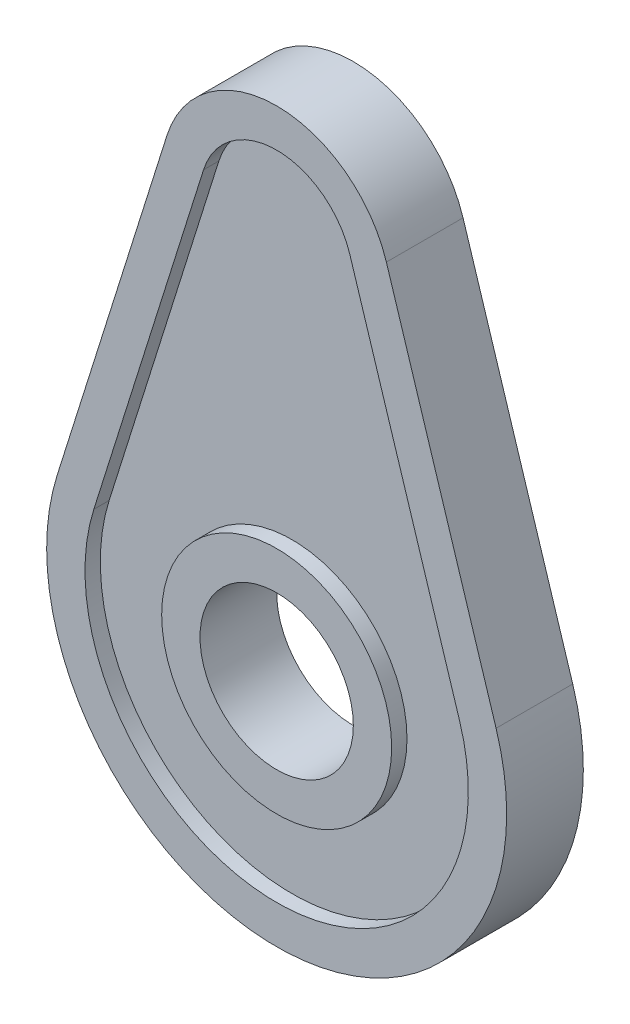
ISO-10303-21;
HEADER;
FILE_DESCRIPTION(('STEP AP214'),'2;1');
FILE_NAME('part.step','',(''),(''),'','','');
FILE_SCHEMA(('AUTOMOTIVE_DESIGN { 1 0 10303 214 1 1 1 1 }'));
ENDSEC;
DATA;
#1=APPLICATION_CONTEXT('core data for automotive mechanical design processes');
#2=APPLICATION_PROTOCOL_DEFINITION('international standard','automotive_design',2000,#1);
#3=PRODUCT_CONTEXT('',#1,'mechanical');
#4=PRODUCT('Part','Part','',(#3));
#5=PRODUCT_RELATED_PRODUCT_CATEGORY('part','',(#4));
#6=PRODUCT_DEFINITION_FORMATION('','',#4);
#7=PRODUCT_DEFINITION_CONTEXT('part definition',#1,'design');
#8=PRODUCT_DEFINITION('design','',#6,#7);
#9=PRODUCT_DEFINITION_SHAPE('','',#8);
#10=(LENGTH_UNIT() NAMED_UNIT(*) SI_UNIT(.MILLI.,.METRE.));
#11=(NAMED_UNIT(*) PLANE_ANGLE_UNIT() SI_UNIT($,.RADIAN.));
#12=(NAMED_UNIT(*) SI_UNIT($,.STERADIAN.) SOLID_ANGLE_UNIT());
#13=UNCERTAINTY_MEASURE_WITH_UNIT(LENGTH_MEASURE(1.E-05),#10,'distance_accuracy_value','');
#14=(GEOMETRIC_REPRESENTATION_CONTEXT(3) GLOBAL_UNCERTAINTY_ASSIGNED_CONTEXT((#13)) GLOBAL_UNIT_ASSIGNED_CONTEXT((#10,
#11,#12)) REPRESENTATION_CONTEXT('',''));
#15=CARTESIAN_POINT('',(0.,0.,0.));
#16=DIRECTION('',(0.,0.,1.));
#17=DIRECTION('',(1.,0.,0.));
#18=AXIS2_PLACEMENT_3D('',#15,#16,#17);
#19=CARTESIAN_POINT('',(0.,0.,0.));
#20=DIRECTION('',(0.,0.,1.));
#21=DIRECTION('',(1.,0.,0.));
#22=AXIS2_PLACEMENT_3D('',#19,#20,#21);
#23=PLANE('',#22);
#24=CARTESIAN_POINT('',(0.,0.,0.));
#25=DIRECTION('',(0.,0.,1.));
#26=DIRECTION('',(1.,0.,0.));
#27=AXIS2_PLACEMENT_3D('',#24,#25,#26);
#28=CIRCLE('',#27,10.);
#29=CARTESIAN_POINT('',(10.,0.,0.));
#30=VERTEX_POINT('',#29);
#31=EDGE_CURVE('E200',#30,#30,#28,.T.);
#32=ORIENTED_EDGE('',*,*,#31,.T.);
#33=EDGE_LOOP('',(#32));
#34=FACE_BOUND('',#33,.T.);
#35=CARTESIAN_POINT('',(0.,0.,0.));
#36=DIRECTION('',(0.,0.,1.));
#37=DIRECTION('',(1.,0.,0.));
#38=AXIS2_PLACEMENT_3D('',#35,#36,#37);
#39=CIRCLE('',#38,15.);
#40=CARTESIAN_POINT('',(15.,0.,0.));
#41=VERTEX_POINT('',#40);
#42=EDGE_CURVE('E153',#41,#41,#39,.T.);
#43=ORIENTED_EDGE('',*,*,#42,.F.);
#44=EDGE_LOOP('',(#43));
#45=FACE_BOUND('',#44,.T.);
#46=ADVANCED_FACE('F37',(#34,#45),#23,.F.);
#47=CARTESIAN_POINT('',(0.,0.,10.));
#48=DIRECTION('',(0.,0.,1.));
#49=DIRECTION('',(1.,0.,0.));
#50=AXIS2_PLACEMENT_3D('',#47,#48,#49);
#51=PLANE('',#50);
#52=CARTESIAN_POINT('',(0.,0.,10.));
#53=DIRECTION('',(0.,0.,1.));
#54=DIRECTION('',(1.,0.,0.));
#55=AXIS2_PLACEMENT_3D('',#52,#53,#54);
#56=CIRCLE('',#55,10.);
#57=CARTESIAN_POINT('',(10.,0.,10.));
#58=VERTEX_POINT('',#57);
#59=EDGE_CURVE('E206',#58,#58,#56,.T.);
#60=ORIENTED_EDGE('',*,*,#59,.F.);
#61=EDGE_LOOP('',(#60));
#62=FACE_BOUND('',#61,.T.);
#63=CARTESIAN_POINT('',(0.,0.,10.));
#64=DIRECTION('',(0.,0.,1.));
#65=DIRECTION('',(1.,0.,0.));
#66=AXIS2_PLACEMENT_3D('',#63,#64,#65);
#67=CIRCLE('',#66,15.);
#68=CARTESIAN_POINT('',(15.,0.,10.));
#69=VERTEX_POINT('',#68);
#70=EDGE_CURVE('E166',#69,#69,#67,.T.);
#71=ORIENTED_EDGE('',*,*,#70,.T.);
#72=EDGE_LOOP('',(#71));
#73=FACE_BOUND('',#72,.T.);
#74=ADVANCED_FACE('F263',(#62,#73),#51,.T.);
#75=CARTESIAN_POINT('',(0.,0.,10.));
#76=DIRECTION('',(0.,0.,1.));
#77=DIRECTION('',(1.,0.,0.));
#78=AXIS2_PLACEMENT_3D('',#75,#76,#77);
#79=CIRCLE('',#78,25.);
#80=CARTESIAN_POINT('',(-23.8484800354236,7.50000000000001,10.));
#81=VERTEX_POINT('',#80);
#82=CARTESIAN_POINT('',(23.8484800354236,7.50000000000001,10.));
#83=VERTEX_POINT('',#82);
#84=EDGE_CURVE('E60',#81,#83,#79,.T.);
#85=ORIENTED_EDGE('',*,*,#84,.F.);
#86=DIRECTION('',(-0.3,-0.953939201416946,0.));
#87=VECTOR('',#86,1.);
#88=CARTESIAN_POINT('',(-9.53939201416945,53.,10.));
#89=LINE('',#88,#87);
#90=CARTESIAN_POINT('',(-9.53939201416945,53.,10.));
#91=VERTEX_POINT('',#90);
#92=EDGE_CURVE('E179',#91,#81,#89,.T.);
#93=ORIENTED_EDGE('',*,*,#92,.F.);
#94=CARTESIAN_POINT('',(0.,50.,10.));
#95=DIRECTION('',(0.,0.,1.));
#96=DIRECTION('',(1.,0.,0.));
#97=AXIS2_PLACEMENT_3D('',#94,#95,#96);
#98=CIRCLE('',#97,10.);
#99=CARTESIAN_POINT('',(9.53939201416945,53.,10.));
#100=VERTEX_POINT('',#99);
#101=EDGE_CURVE('E193',#100,#91,#98,.T.);
#102=ORIENTED_EDGE('',*,*,#101,.F.);
#103=DIRECTION('',(-0.3,0.953939201416946,0.));
#104=VECTOR('',#103,1.);
#105=CARTESIAN_POINT('',(23.8484800354236,7.50000000000001,10.));
#106=LINE('',#105,#104);
#107=EDGE_CURVE('E190',#83,#100,#106,.T.);
#108=ORIENTED_EDGE('',*,*,#107,.F.);
#109=EDGE_LOOP('',(#85,#93,#102,#108));
#110=FACE_BOUND('',#109,.T.);
#111=CARTESIAN_POINT('',(0.,0.,10.));
#112=DIRECTION('',(0.,0.,1.));
#113=DIRECTION('',(1.,0.,0.));
#114=AXIS2_PLACEMENT_3D('',#111,#112,#113);
#115=CIRCLE('',#114,30.);
#116=CARTESIAN_POINT('',(-28.6181760425084,9.,10.));
#117=VERTEX_POINT('',#116);
#118=CARTESIAN_POINT('',(28.6181760425084,9.,10.));
#119=VERTEX_POINT('',#118);
#120=EDGE_CURVE('E212',#117,#119,#115,.T.);
#121=ORIENTED_EDGE('',*,*,#120,.T.);
#122=DIRECTION('',(-0.3,0.953939201416946,0.));
#123=VECTOR('',#122,1.);
#124=CARTESIAN_POINT('',(14.3090880212542,54.5,10.));
#125=LINE('',#124,#123);
#126=CARTESIAN_POINT('',(14.3090880212542,54.5,10.));
#127=VERTEX_POINT('',#126);
#128=EDGE_CURVE('E215',#119,#127,#125,.T.);
#129=ORIENTED_EDGE('',*,*,#128,.T.);
#130=CARTESIAN_POINT('',(0.,50.,10.));
#131=DIRECTION('',(0.,0.,1.));
#132=DIRECTION('',(1.,0.,0.));
#133=AXIS2_PLACEMENT_3D('',#130,#131,#132);
#134=CIRCLE('',#133,15.);
#135=CARTESIAN_POINT('',(-14.3090880212542,54.5,10.));
#136=VERTEX_POINT('',#135);
#137=EDGE_CURVE('E218',#127,#136,#134,.T.);
#138=ORIENTED_EDGE('',*,*,#137,.T.);
#139=DIRECTION('',(-0.3,-0.953939201416946,0.));
#140=VECTOR('',#139,1.);
#141=CARTESIAN_POINT('',(-14.3090880212542,54.5,10.));
#142=LINE('',#141,#140);
#143=EDGE_CURVE('E220',#136,#117,#142,.T.);
#144=ORIENTED_EDGE('',*,*,#143,.T.);
#145=EDGE_LOOP('',(#121,#129,#138,#144));
#146=FACE_BOUND('',#145,.T.);
#147=ADVANCED_FACE('F254',(#110,#146),#51,.T.);
#148=CARTESIAN_POINT('',(0.,0.,0.));
#149=DIRECTION('',(0.,0.,1.));
#150=DIRECTION('',(1.,0.,0.));
#151=AXIS2_PLACEMENT_3D('',#148,#149,#150);
#152=CIRCLE('',#151,25.);
#153=CARTESIAN_POINT('',(-23.8484800354236,7.50000000000001,0.));
#154=VERTEX_POINT('',#153);
#155=CARTESIAN_POINT('',(23.8484800354236,7.50000000000001,0.));
#156=VERTEX_POINT('',#155);
#157=EDGE_CURVE('E52',#154,#156,#152,.T.);
#158=ORIENTED_EDGE('',*,*,#157,.T.);
#159=DIRECTION('',(-0.3,0.953939201416946,0.));
#160=VECTOR('',#159,1.);
#161=CARTESIAN_POINT('',(23.8484800354236,7.50000000000001,0.));
#162=LINE('',#161,#160);
#163=CARTESIAN_POINT('',(9.53939201416945,53.,0.));
#164=VERTEX_POINT('',#163);
#165=EDGE_CURVE('E147',#156,#164,#162,.T.);
#166=ORIENTED_EDGE('',*,*,#165,.T.);
#167=CARTESIAN_POINT('',(0.,50.,0.));
#168=DIRECTION('',(0.,0.,1.));
#169=DIRECTION('',(1.,0.,0.));
#170=AXIS2_PLACEMENT_3D('',#167,#168,#169);
#171=CIRCLE('',#170,10.);
#172=CARTESIAN_POINT('',(-9.53939201416945,53.,0.));
#173=VERTEX_POINT('',#172);
#174=EDGE_CURVE('E150',#164,#173,#171,.T.);
#175=ORIENTED_EDGE('',*,*,#174,.T.);
#176=DIRECTION('',(-0.3,-0.953939201416946,0.));
#177=VECTOR('',#176,1.);
#178=CARTESIAN_POINT('',(-9.53939201416945,53.,0.));
#179=LINE('',#178,#177);
#180=EDGE_CURVE('E159',#173,#154,#179,.T.);
#181=ORIENTED_EDGE('',*,*,#180,.T.);
#182=EDGE_LOOP('',(#158,#166,#175,#181));
#183=FACE_BOUND('',#182,.T.);
#184=CARTESIAN_POINT('',(0.,0.,0.));
#185=DIRECTION('',(0.,0.,1.));
#186=DIRECTION('',(1.,0.,0.));
#187=AXIS2_PLACEMENT_3D('',#184,#185,#186);
#188=CIRCLE('',#187,30.);
#189=CARTESIAN_POINT('',(-28.6181760425084,9.,0.));
#190=VERTEX_POINT('',#189);
#191=CARTESIAN_POINT('',(28.6181760425084,9.,0.));
#192=VERTEX_POINT('',#191);
#193=EDGE_CURVE('E209',#190,#192,#188,.T.);
#194=ORIENTED_EDGE('',*,*,#193,.F.);
#195=DIRECTION('',(-0.3,-0.953939201416946,0.));
#196=VECTOR('',#195,1.);
#197=CARTESIAN_POINT('',(-14.3090880212542,54.5,0.));
#198=LINE('',#197,#196);
#199=CARTESIAN_POINT('',(-14.3090880212542,54.5,0.));
#200=VERTEX_POINT('',#199);
#201=EDGE_CURVE('E216',#200,#190,#198,.T.);
#202=ORIENTED_EDGE('',*,*,#201,.F.);
#203=CARTESIAN_POINT('',(0.,50.,0.));
#204=DIRECTION('',(0.,0.,1.));
#205=DIRECTION('',(1.,0.,0.));
#206=AXIS2_PLACEMENT_3D('',#203,#204,#205);
#207=CIRCLE('',#206,15.);
#208=CARTESIAN_POINT('',(14.3090880212542,54.5,0.));
#209=VERTEX_POINT('',#208);
#210=EDGE_CURVE('E227',#209,#200,#207,.T.);
#211=ORIENTED_EDGE('',*,*,#210,.F.);
#212=DIRECTION('',(-0.3,0.953939201416946,0.));
#213=VECTOR('',#212,1.);
#214=CARTESIAN_POINT('',(14.3090880212542,54.5,0.));
#215=LINE('',#214,#213);
#216=EDGE_CURVE('E225',#192,#209,#215,.T.);
#217=ORIENTED_EDGE('',*,*,#216,.F.);
#218=EDGE_LOOP('',(#194,#202,#211,#217));
#219=FACE_BOUND('',#218,.T.);
#220=ADVANCED_FACE('F245',(#183,#219),#23,.F.);
#221=CARTESIAN_POINT('',(0.,0.,10.));
#222=DIRECTION('',(0.,0.,-1.));
#223=DIRECTION('',(-1.,0.,0.));
#224=AXIS2_PLACEMENT_3D('',#221,#222,#223);
#225=CYLINDRICAL_SURFACE('',#224,30.);
#226=ORIENTED_EDGE('',*,*,#193,.T.);
#227=DIRECTION('',(0.,0.,-1.));
#228=VECTOR('',#227,1.);
#229=CARTESIAN_POINT('',(28.6181760425084,9.,10.));
#230=LINE('',#229,#228);
#231=EDGE_CURVE('E11',#119,#192,#230,.T.);
#232=ORIENTED_EDGE('',*,*,#231,.F.);
#233=ORIENTED_EDGE('',*,*,#120,.F.);
#234=DIRECTION('',(0.,0.,-1.));
#235=VECTOR('',#234,1.);
#236=CARTESIAN_POINT('',(-28.6181760425084,9.,10.));
#237=LINE('',#236,#235);
#238=EDGE_CURVE('E222',#117,#190,#237,.T.);
#239=ORIENTED_EDGE('',*,*,#238,.T.);
#240=EDGE_LOOP('',(#226,#232,#233,#239));
#241=FACE_BOUND('',#240,.T.);
#242=ADVANCED_FACE('F39',(#241),#225,.T.);
#243=CARTESIAN_POINT('',(14.3090880212542,54.5,10.));
#244=DIRECTION('',(-0.953939201416946,-0.3,0.));
#245=DIRECTION('',(0.3,-0.953939201416946,0.));
#246=AXIS2_PLACEMENT_3D('',#243,#244,#245);
#247=PLANE('',#246);
#248=ORIENTED_EDGE('',*,*,#216,.T.);
#249=DIRECTION('',(0.,0.,-1.));
#250=VECTOR('',#249,1.);
#251=CARTESIAN_POINT('',(14.3090880212542,54.5,10.));
#252=LINE('',#251,#250);
#253=EDGE_CURVE('E45',#127,#209,#252,.T.);
#254=ORIENTED_EDGE('',*,*,#253,.F.);
#255=ORIENTED_EDGE('',*,*,#128,.F.);
#256=ORIENTED_EDGE('',*,*,#231,.T.);
#257=EDGE_LOOP('',(#248,#254,#255,#256));
#258=FACE_BOUND('',#257,.T.);
#259=ADVANCED_FACE('F255',(#258),#247,.F.);
#260=CARTESIAN_POINT('',(0.,50.,10.));
#261=DIRECTION('',(0.,0.,-1.));
#262=DIRECTION('',(-1.,0.,0.));
#263=AXIS2_PLACEMENT_3D('',#260,#261,#262);
#264=CYLINDRICAL_SURFACE('',#263,15.);
#265=ORIENTED_EDGE('',*,*,#210,.T.);
#266=DIRECTION('',(0.,0.,-1.));
#267=VECTOR('',#266,1.);
#268=CARTESIAN_POINT('',(-14.3090880212542,54.5,10.));
#269=LINE('',#268,#267);
#270=EDGE_CURVE('E232',#136,#200,#269,.T.);
#271=ORIENTED_EDGE('',*,*,#270,.F.);
#272=ORIENTED_EDGE('',*,*,#137,.F.);
#273=ORIENTED_EDGE('',*,*,#253,.T.);
#274=EDGE_LOOP('',(#265,#271,#272,#273));
#275=FACE_BOUND('',#274,.T.);
#276=ADVANCED_FACE('F239',(#275),#264,.T.);
#277=CARTESIAN_POINT('',(-14.3090880212542,54.5,10.));
#278=DIRECTION('',(0.953939201416946,-0.3,0.));
#279=DIRECTION('',(0.3,0.953939201416946,0.));
#280=AXIS2_PLACEMENT_3D('',#277,#278,#279);
#281=PLANE('',#280);
#282=ORIENTED_EDGE('',*,*,#201,.T.);
#283=ORIENTED_EDGE('',*,*,#238,.F.);
#284=ORIENTED_EDGE('',*,*,#143,.F.);
#285=ORIENTED_EDGE('',*,*,#270,.T.);
#286=EDGE_LOOP('',(#282,#283,#284,#285));
#287=FACE_BOUND('',#286,.T.);
#288=ADVANCED_FACE('F248',(#287),#281,.F.);
#289=CARTESIAN_POINT('',(0.,0.,10.));
#290=DIRECTION('',(0.,0.,-1.));
#291=DIRECTION('',(-1.,0.,0.));
#292=AXIS2_PLACEMENT_3D('',#289,#290,#291);
#293=CYLINDRICAL_SURFACE('',#292,10.);
#294=ORIENTED_EDGE('',*,*,#59,.T.);
#295=EDGE_LOOP('',(#294));
#296=FACE_BOUND('',#295,.T.);
#297=ORIENTED_EDGE('',*,*,#31,.F.);
#298=EDGE_LOOP('',(#297));
#299=FACE_BOUND('',#298,.T.);
#300=ADVANCED_FACE('F322',(#296,#299),#293,.F.);
#301=CARTESIAN_POINT('',(0.,0.,8.));
#302=DIRECTION('',(0.,0.,1.));
#303=DIRECTION('',(1.,0.,0.));
#304=AXIS2_PLACEMENT_3D('',#301,#302,#303);
#305=CYLINDRICAL_SURFACE('',#304,25.);
#306=ORIENTED_EDGE('',*,*,#84,.T.);
#307=DIRECTION('',(0.,0.,1.));
#308=VECTOR('',#307,1.);
#309=CARTESIAN_POINT('',(23.8484800354236,7.50000000000001,8.));
#310=LINE('',#309,#308);
#311=CARTESIAN_POINT('',(23.8484800354236,7.50000000000001,8.));
#312=VERTEX_POINT('',#311);
#313=EDGE_CURVE('E188',#312,#83,#310,.T.);
#314=ORIENTED_EDGE('',*,*,#313,.F.);
#315=CARTESIAN_POINT('',(0.,0.,8.));
#316=DIRECTION('',(0.,0.,1.));
#317=DIRECTION('',(1.,0.,0.));
#318=AXIS2_PLACEMENT_3D('',#315,#316,#317);
#319=CIRCLE('',#318,25.);
#320=CARTESIAN_POINT('',(-23.8484800354236,7.50000000000001,8.));
#321=VERTEX_POINT('',#320);
#322=EDGE_CURVE('E175',#321,#312,#319,.T.);
#323=ORIENTED_EDGE('',*,*,#322,.F.);
#324=DIRECTION('',(0.,0.,1.));
#325=VECTOR('',#324,1.);
#326=CARTESIAN_POINT('',(-23.8484800354236,7.50000000000001,8.));
#327=LINE('',#326,#325);
#328=EDGE_CURVE('E198',#321,#81,#327,.T.);
#329=ORIENTED_EDGE('',*,*,#328,.T.);
#330=EDGE_LOOP('',(#306,#314,#323,#329));
#331=FACE_BOUND('',#330,.T.);
#332=ADVANCED_FACE('F312',(#331),#305,.F.);
#333=CARTESIAN_POINT('',(-9.53939201416945,53.,8.));
#334=DIRECTION('',(-0.953939201416946,0.3,0.));
#335=DIRECTION('',(-0.3,-0.953939201416946,0.));
#336=AXIS2_PLACEMENT_3D('',#333,#334,#335);
#337=PLANE('',#336);
#338=ORIENTED_EDGE('',*,*,#92,.T.);
#339=ORIENTED_EDGE('',*,*,#328,.F.);
#340=DIRECTION('',(-0.3,-0.953939201416946,0.));
#341=VECTOR('',#340,1.);
#342=CARTESIAN_POINT('',(-9.53939201416945,53.,8.));
#343=LINE('',#342,#341);
#344=CARTESIAN_POINT('',(-9.53939201416945,53.,8.));
#345=VERTEX_POINT('',#344);
#346=EDGE_CURVE('E185',#345,#321,#343,.T.);
#347=ORIENTED_EDGE('',*,*,#346,.F.);
#348=DIRECTION('',(0.,0.,1.));
#349=VECTOR('',#348,1.);
#350=CARTESIAN_POINT('',(-9.53939201416945,53.,8.));
#351=LINE('',#350,#349);
#352=EDGE_CURVE('E201',#345,#91,#351,.T.);
#353=ORIENTED_EDGE('',*,*,#352,.T.);
#354=EDGE_LOOP('',(#338,#339,#347,#353));
#355=FACE_BOUND('',#354,.T.);
#356=ADVANCED_FACE('F308',(#355),#337,.F.);
#357=CARTESIAN_POINT('',(0.,50.,8.));
#358=DIRECTION('',(0.,0.,1.));
#359=DIRECTION('',(1.,0.,0.));
#360=AXIS2_PLACEMENT_3D('',#357,#358,#359);
#361=CYLINDRICAL_SURFACE('',#360,10.);
#362=ORIENTED_EDGE('',*,*,#101,.T.);
#363=ORIENTED_EDGE('',*,*,#352,.F.);
#364=CARTESIAN_POINT('',(0.,50.,8.));
#365=DIRECTION('',(0.,0.,1.));
#366=DIRECTION('',(1.,0.,0.));
#367=AXIS2_PLACEMENT_3D('',#364,#365,#366);
#368=CIRCLE('',#367,10.);
#369=CARTESIAN_POINT('',(9.53939201416945,53.,8.));
#370=VERTEX_POINT('',#369);
#371=EDGE_CURVE('E182',#370,#345,#368,.T.);
#372=ORIENTED_EDGE('',*,*,#371,.F.);
#373=DIRECTION('',(0.,0.,1.));
#374=VECTOR('',#373,1.);
#375=CARTESIAN_POINT('',(9.53939201416945,53.,8.));
#376=LINE('',#375,#374);
#377=EDGE_CURVE('E203',#370,#100,#376,.T.);
#378=ORIENTED_EDGE('',*,*,#377,.T.);
#379=EDGE_LOOP('',(#362,#363,#372,#378));
#380=FACE_BOUND('',#379,.T.);
#381=ADVANCED_FACE('F311',(#380),#361,.F.);
#382=CARTESIAN_POINT('',(23.8484800354236,7.50000000000001,8.));
#383=DIRECTION('',(0.953939201416946,0.3,0.));
#384=DIRECTION('',(-0.3,0.953939201416946,0.));
#385=AXIS2_PLACEMENT_3D('',#382,#383,#384);
#386=PLANE('',#385);
#387=ORIENTED_EDGE('',*,*,#107,.T.);
#388=ORIENTED_EDGE('',*,*,#377,.F.);
#389=DIRECTION('',(-0.3,0.953939201416946,0.));
#390=VECTOR('',#389,1.);
#391=CARTESIAN_POINT('',(23.8484800354236,7.50000000000001,8.));
#392=LINE('',#391,#390);
#393=EDGE_CURVE('E178',#312,#370,#392,.T.);
#394=ORIENTED_EDGE('',*,*,#393,.F.);
#395=ORIENTED_EDGE('',*,*,#313,.T.);
#396=EDGE_LOOP('',(#387,#388,#394,#395));
#397=FACE_BOUND('',#396,.T.);
#398=ADVANCED_FACE('F306',(#397),#386,.F.);
#399=CARTESIAN_POINT('',(0.,0.,8.));
#400=DIRECTION('',(0.,0.,1.));
#401=DIRECTION('',(1.,0.,0.));
#402=AXIS2_PLACEMENT_3D('',#399,#400,#401);
#403=PLANE('',#402);
#404=CARTESIAN_POINT('',(0.,0.,8.));
#405=DIRECTION('',(0.,0.,1.));
#406=DIRECTION('',(1.,0.,0.));
#407=AXIS2_PLACEMENT_3D('',#404,#405,#406);
#408=CIRCLE('',#407,15.);
#409=CARTESIAN_POINT('',(15.,0.,8.));
#410=VERTEX_POINT('',#409);
#411=EDGE_CURVE('E170',#410,#410,#408,.T.);
#412=ORIENTED_EDGE('',*,*,#411,.F.);
#413=EDGE_LOOP('',(#412));
#414=FACE_BOUND('',#413,.T.);
#415=ORIENTED_EDGE('',*,*,#322,.T.);
#416=ORIENTED_EDGE('',*,*,#393,.T.);
#417=ORIENTED_EDGE('',*,*,#371,.T.);
#418=ORIENTED_EDGE('',*,*,#346,.T.);
#419=EDGE_LOOP('',(#415,#416,#417,#418));
#420=FACE_BOUND('',#419,.T.);
#421=ADVANCED_FACE('F302',(#414,#420),#403,.T.);
#422=CARTESIAN_POINT('',(0.,0.,8.));
#423=DIRECTION('',(0.,0.,1.));
#424=DIRECTION('',(1.,0.,0.));
#425=AXIS2_PLACEMENT_3D('',#422,#423,#424);
#426=CYLINDRICAL_SURFACE('',#425,15.);
#427=ORIENTED_EDGE('',*,*,#411,.T.);
#428=EDGE_LOOP('',(#427));
#429=FACE_BOUND('',#428,.T.);
#430=ORIENTED_EDGE('',*,*,#70,.F.);
#431=EDGE_LOOP('',(#430));
#432=FACE_BOUND('',#431,.T.);
#433=ADVANCED_FACE('F299',(#429,#432),#426,.T.);
#434=CARTESIAN_POINT('',(0.,0.,2.));
#435=DIRECTION('',(0.,0.,-1.));
#436=DIRECTION('',(1.,0.,0.));
#437=AXIS2_PLACEMENT_3D('',#434,#435,#436);
#438=PLANE('',#437);
#439=CARTESIAN_POINT('',(0.,0.,2.));
#440=DIRECTION('',(0.,0.,1.));
#441=DIRECTION('',(1.,0.,0.));
#442=AXIS2_PLACEMENT_3D('',#439,#440,#441);
#443=CIRCLE('',#442,25.);
#444=CARTESIAN_POINT('',(-23.8484800354236,7.50000000000001,2.));
#445=VERTEX_POINT('',#444);
#446=CARTESIAN_POINT('',(23.8484800354236,7.50000000000001,2.));
#447=VERTEX_POINT('',#446);
#448=EDGE_CURVE('E138',#445,#447,#443,.T.);
#449=ORIENTED_EDGE('',*,*,#448,.F.);
#450=DIRECTION('',(-0.3,-0.953939201416946,0.));
#451=VECTOR('',#450,1.);
#452=CARTESIAN_POINT('',(-9.53939201416945,53.,2.));
#453=LINE('',#452,#451);
#454=CARTESIAN_POINT('',(-9.53939201416945,53.,2.));
#455=VERTEX_POINT('',#454);
#456=EDGE_CURVE('E128',#455,#445,#453,.T.);
#457=ORIENTED_EDGE('',*,*,#456,.F.);
#458=CARTESIAN_POINT('',(0.,50.,2.));
#459=DIRECTION('',(0.,0.,1.));
#460=DIRECTION('',(1.,0.,0.));
#461=AXIS2_PLACEMENT_3D('',#458,#459,#460);
#462=CIRCLE('',#461,10.);
#463=CARTESIAN_POINT('',(9.53939201416945,53.,2.));
#464=VERTEX_POINT('',#463);
#465=EDGE_CURVE('E137',#464,#455,#462,.T.);
#466=ORIENTED_EDGE('',*,*,#465,.F.);
#467=DIRECTION('',(-0.3,0.953939201416946,0.));
#468=VECTOR('',#467,1.);
#469=CARTESIAN_POINT('',(23.8484800354236,7.50000000000001,2.));
#470=LINE('',#469,#468);
#471=EDGE_CURVE('E143',#447,#464,#470,.T.);
#472=ORIENTED_EDGE('',*,*,#471,.F.);
#473=EDGE_LOOP('',(#449,#457,#466,#472));
#474=FACE_BOUND('',#473,.T.);
#475=CARTESIAN_POINT('',(0.,0.,2.));
#476=DIRECTION('',(0.,0.,1.));
#477=DIRECTION('',(1.,0.,0.));
#478=AXIS2_PLACEMENT_3D('',#475,#476,#477);
#479=CIRCLE('',#478,15.);
#480=CARTESIAN_POINT('',(15.,0.,2.));
#481=VERTEX_POINT('',#480);
#482=EDGE_CURVE('E160',#481,#481,#479,.T.);
#483=ORIENTED_EDGE('',*,*,#482,.T.);
#484=EDGE_LOOP('',(#483));
#485=FACE_BOUND('',#484,.T.);
#486=ADVANCED_FACE('F145',(#474,#485),#438,.T.);
#487=CARTESIAN_POINT('',(0.,0.,2.));
#488=DIRECTION('',(0.,0.,-1.));
#489=DIRECTION('',(-1.,0.,0.));
#490=AXIS2_PLACEMENT_3D('',#487,#488,#489);
#491=CYLINDRICAL_SURFACE('',#490,25.);
#492=ORIENTED_EDGE('',*,*,#157,.F.);
#493=DIRECTION('',(0.,0.,-1.));
#494=VECTOR('',#493,1.);
#495=CARTESIAN_POINT('',(-23.8484800354236,7.50000000000001,2.));
#496=LINE('',#495,#494);
#497=EDGE_CURVE('E131',#445,#154,#496,.T.);
#498=ORIENTED_EDGE('',*,*,#497,.F.);
#499=ORIENTED_EDGE('',*,*,#448,.T.);
#500=DIRECTION('',(0.,0.,-1.));
#501=VECTOR('',#500,1.);
#502=CARTESIAN_POINT('',(23.8484800354236,7.50000000000001,2.));
#503=LINE('',#502,#501);
#504=EDGE_CURVE('E164',#447,#156,#503,.T.);
#505=ORIENTED_EDGE('',*,*,#504,.T.);
#506=EDGE_LOOP('',(#492,#498,#499,#505));
#507=FACE_BOUND('',#506,.T.);
#508=ADVANCED_FACE('F141',(#507),#491,.F.);
#509=CARTESIAN_POINT('',(23.8484800354236,7.50000000000001,2.));
#510=DIRECTION('',(-0.953939201416946,-0.3,0.));
#511=DIRECTION('',(0.3,-0.953939201416946,0.));
#512=AXIS2_PLACEMENT_3D('',#509,#510,#511);
#513=PLANE('',#512);
#514=ORIENTED_EDGE('',*,*,#165,.F.);
#515=ORIENTED_EDGE('',*,*,#504,.F.);
#516=ORIENTED_EDGE('',*,*,#471,.T.);
#517=DIRECTION('',(0.,0.,-1.));
#518=VECTOR('',#517,1.);
#519=CARTESIAN_POINT('',(9.53939201416945,53.,2.));
#520=LINE('',#519,#518);
#521=EDGE_CURVE('E167',#464,#164,#520,.T.);
#522=ORIENTED_EDGE('',*,*,#521,.T.);
#523=EDGE_LOOP('',(#514,#515,#516,#522));
#524=FACE_BOUND('',#523,.T.);
#525=ADVANCED_FACE('F284',(#524),#513,.T.);
#526=CARTESIAN_POINT('',(0.,50.,2.));
#527=DIRECTION('',(0.,0.,-1.));
#528=DIRECTION('',(-1.,0.,0.));
#529=AXIS2_PLACEMENT_3D('',#526,#527,#528);
#530=CYLINDRICAL_SURFACE('',#529,10.);
#531=ORIENTED_EDGE('',*,*,#174,.F.);
#532=ORIENTED_EDGE('',*,*,#521,.F.);
#533=ORIENTED_EDGE('',*,*,#465,.T.);
#534=DIRECTION('',(0.,0.,-1.));
#535=VECTOR('',#534,1.);
#536=CARTESIAN_POINT('',(-9.53939201416945,53.,2.));
#537=LINE('',#536,#535);
#538=EDGE_CURVE('E133',#455,#173,#537,.T.);
#539=ORIENTED_EDGE('',*,*,#538,.T.);
#540=EDGE_LOOP('',(#531,#532,#533,#539));
#541=FACE_BOUND('',#540,.T.);
#542=ADVANCED_FACE('F282',(#541),#530,.F.);
#543=CARTESIAN_POINT('',(-9.53939201416945,53.,2.));
#544=DIRECTION('',(0.953939201416946,-0.3,0.));
#545=DIRECTION('',(0.3,0.953939201416946,0.));
#546=AXIS2_PLACEMENT_3D('',#543,#544,#545);
#547=PLANE('',#546);
#548=ORIENTED_EDGE('',*,*,#180,.F.);
#549=ORIENTED_EDGE('',*,*,#538,.F.);
#550=ORIENTED_EDGE('',*,*,#456,.T.);
#551=ORIENTED_EDGE('',*,*,#497,.T.);
#552=EDGE_LOOP('',(#548,#549,#550,#551));
#553=FACE_BOUND('',#552,.T.);
#554=ADVANCED_FACE('F130',(#553),#547,.T.);
#555=CARTESIAN_POINT('',(0.,0.,2.));
#556=DIRECTION('',(0.,0.,-1.));
#557=DIRECTION('',(-1.,0.,0.));
#558=AXIS2_PLACEMENT_3D('',#555,#556,#557);
#559=CYLINDRICAL_SURFACE('',#558,15.);
#560=ORIENTED_EDGE('',*,*,#482,.F.);
#561=EDGE_LOOP('',(#560));
#562=FACE_BOUND('',#561,.T.);
#563=ORIENTED_EDGE('',*,*,#42,.T.);
#564=EDGE_LOOP('',(#563));
#565=FACE_BOUND('',#564,.T.);
#566=ADVANCED_FACE('F297',(#562,#565),#559,.T.);
#567=CLOSED_SHELL('',(#46,#74,#147,#220,#242,#259,#276,#288,#300,#332,#356,#381,#398,#421,#433,
#486,#508,#525,#542,#554,#566));
#568=MANIFOLD_SOLID_BREP('B2',#567);
#569=ADVANCED_BREP_SHAPE_REPRESENTATION('',(#18,#568),#14);
#570=SHAPE_DEFINITION_REPRESENTATION(#9,#569);
ENDSEC;
END-ISO-10303-21;
